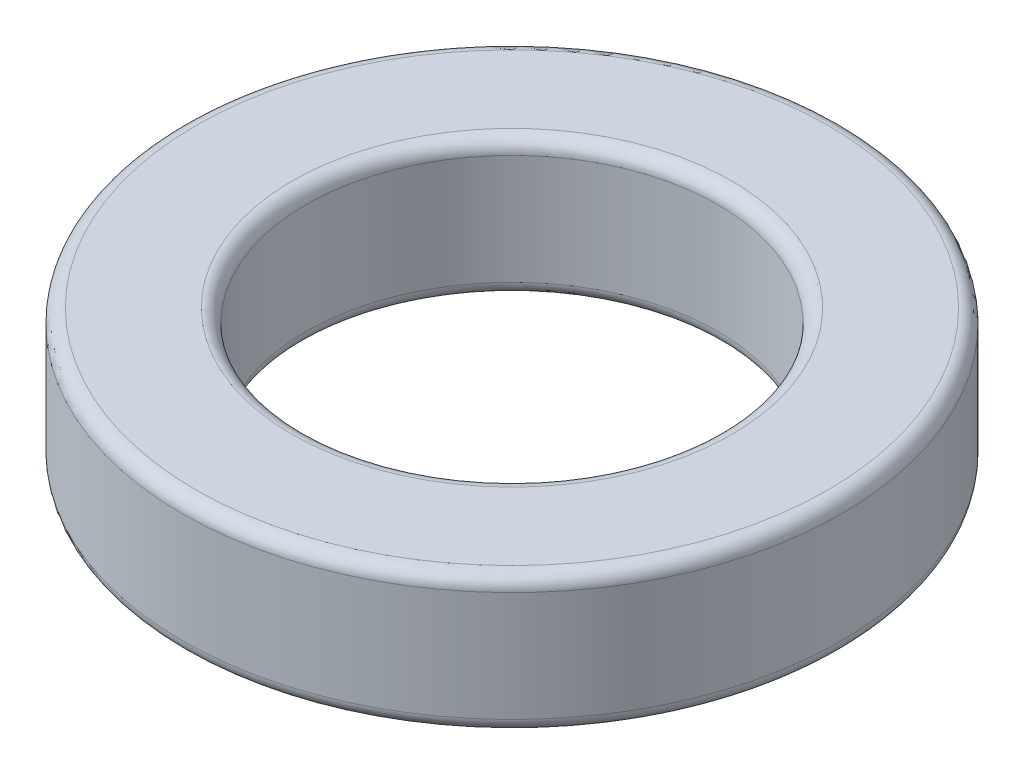
ISO-10303-21;
HEADER;
FILE_DESCRIPTION(('STEP AP214'),'2;1');
FILE_NAME('part.step','',(''),(''),'','','');
FILE_SCHEMA(('AUTOMOTIVE_DESIGN { 1 0 10303 214 1 1 1 1 }'));
ENDSEC;
DATA;
#1=APPLICATION_CONTEXT('core data for automotive mechanical design processes');
#2=APPLICATION_PROTOCOL_DEFINITION('international standard','automotive_design',2000,#1);
#3=PRODUCT_CONTEXT('',#1,'mechanical');
#4=PRODUCT('Part','Part','',(#3));
#5=PRODUCT_RELATED_PRODUCT_CATEGORY('part','',(#4));
#6=PRODUCT_DEFINITION_FORMATION('','',#4);
#7=PRODUCT_DEFINITION_CONTEXT('part definition',#1,'design');
#8=PRODUCT_DEFINITION('design','',#6,#7);
#9=PRODUCT_DEFINITION_SHAPE('','',#8);
#10=(LENGTH_UNIT() NAMED_UNIT(*) SI_UNIT(.MILLI.,.METRE.));
#11=(NAMED_UNIT(*) PLANE_ANGLE_UNIT() SI_UNIT($,.RADIAN.));
#12=(NAMED_UNIT(*) SI_UNIT($,.STERADIAN.) SOLID_ANGLE_UNIT());
#13=UNCERTAINTY_MEASURE_WITH_UNIT(LENGTH_MEASURE(1.E-05),#10,'distance_accuracy_value','');
#14=(GEOMETRIC_REPRESENTATION_CONTEXT(3) GLOBAL_UNCERTAINTY_ASSIGNED_CONTEXT((#13)) GLOBAL_UNIT_ASSIGNED_CONTEXT((#10,
#11,#12)) REPRESENTATION_CONTEXT('',''));
#15=CARTESIAN_POINT('',(0.,0.,0.));
#16=DIRECTION('',(0.,0.,1.));
#17=DIRECTION('',(1.,0.,0.));
#18=AXIS2_PLACEMENT_3D('',#15,#16,#17);
#19=CARTESIAN_POINT('',(0.,-0.5,0.));
#20=DIRECTION('',(0.,1.,0.));
#21=DIRECTION('',(0.,0.,1.));
#22=AXIS2_PLACEMENT_3D('',#19,#20,#21);
#23=TOROIDAL_SURFACE('',#22,11.5,0.5);
#24=CARTESIAN_POINT('',(0.,-0.5,0.));
#25=DIRECTION('',(0.,1.,0.));
#26=DIRECTION('',(0.,0.,1.));
#27=AXIS2_PLACEMENT_3D('',#24,#25,#26);
#28=CIRCLE('',#27,12.);
#29=CARTESIAN_POINT('',(0.,-0.5,12.));
#30=VERTEX_POINT('',#29);
#31=EDGE_CURVE('E10',#30,#30,#28,.T.);
#32=ORIENTED_EDGE('',*,*,#31,.T.);
#33=EDGE_LOOP('',(#32));
#34=FACE_BOUND('',#33,.T.);
#35=CARTESIAN_POINT('',(0.,0.,0.));
#36=DIRECTION('',(0.,1.,0.));
#37=DIRECTION('',(0.,0.,1.));
#38=AXIS2_PLACEMENT_3D('',#35,#36,#37);
#39=CIRCLE('',#38,11.5);
#40=CARTESIAN_POINT('',(0.,0.,11.5));
#41=VERTEX_POINT('',#40);
#42=EDGE_CURVE('E76',#41,#41,#39,.T.);
#43=ORIENTED_EDGE('',*,*,#42,.F.);
#44=EDGE_LOOP('',(#43));
#45=FACE_BOUND('',#44,.T.);
#46=ADVANCED_FACE('F41',(#34,#45),#23,.T.);
#47=CARTESIAN_POINT('',(0.,-5.,0.));
#48=DIRECTION('',(0.,1.,0.));
#49=DIRECTION('',(0.,0.,1.));
#50=AXIS2_PLACEMENT_3D('',#47,#48,#49);
#51=CYLINDRICAL_SURFACE('',#50,12.);
#52=CARTESIAN_POINT('',(0.,-4.5,0.));
#53=DIRECTION('',(0.,1.,0.));
#54=DIRECTION('',(0.,0.,1.));
#55=AXIS2_PLACEMENT_3D('',#52,#53,#54);
#56=CIRCLE('',#55,12.);
#57=CARTESIAN_POINT('',(0.,-4.5,12.));
#58=VERTEX_POINT('',#57);
#59=EDGE_CURVE('E48',#58,#58,#56,.T.);
#60=ORIENTED_EDGE('',*,*,#59,.T.);
#61=EDGE_LOOP('',(#60));
#62=FACE_BOUND('',#61,.T.);
#63=ORIENTED_EDGE('',*,*,#31,.F.);
#64=EDGE_LOOP('',(#63));
#65=FACE_BOUND('',#64,.T.);
#66=ADVANCED_FACE('F85',(#62,#65),#51,.T.);
#67=CARTESIAN_POINT('',(0.,-4.5,0.));
#68=DIRECTION('',(0.,1.,0.));
#69=DIRECTION('',(0.,0.,1.));
#70=AXIS2_PLACEMENT_3D('',#67,#68,#69);
#71=TOROIDAL_SURFACE('',#70,11.5,0.5);
#72=CARTESIAN_POINT('',(0.,-5.,0.));
#73=DIRECTION('',(0.,1.,0.));
#74=DIRECTION('',(0.,0.,1.));
#75=AXIS2_PLACEMENT_3D('',#72,#73,#74);
#76=CIRCLE('',#75,11.5);
#77=CARTESIAN_POINT('',(0.,-5.,11.5));
#78=VERTEX_POINT('',#77);
#79=EDGE_CURVE('E53',#78,#78,#76,.T.);
#80=ORIENTED_EDGE('',*,*,#79,.T.);
#81=EDGE_LOOP('',(#80));
#82=FACE_BOUND('',#81,.T.);
#83=ORIENTED_EDGE('',*,*,#59,.F.);
#84=EDGE_LOOP('',(#83));
#85=FACE_BOUND('',#84,.T.);
#86=ADVANCED_FACE('F89',(#82,#85),#71,.T.);
#87=CARTESIAN_POINT('',(11.5,-5.,0.));
#88=DIRECTION('',(0.,-1.,0.));
#89=DIRECTION('',(0.,0.,-1.));
#90=AXIS2_PLACEMENT_3D('',#87,#88,#89);
#91=PLANE('',#90);
#92=CARTESIAN_POINT('',(0.,-5.,0.));
#93=DIRECTION('',(0.,1.,0.));
#94=DIRECTION('',(0.,0.,1.));
#95=AXIS2_PLACEMENT_3D('',#92,#93,#94);
#96=CIRCLE('',#95,8.);
#97=CARTESIAN_POINT('',(0.,-5.,8.));
#98=VERTEX_POINT('',#97);
#99=EDGE_CURVE('E58',#98,#98,#96,.T.);
#100=ORIENTED_EDGE('',*,*,#99,.T.);
#101=EDGE_LOOP('',(#100));
#102=FACE_BOUND('',#101,.T.);
#103=ORIENTED_EDGE('',*,*,#79,.F.);
#104=EDGE_LOOP('',(#103));
#105=FACE_BOUND('',#104,.T.);
#106=ADVANCED_FACE('F93',(#102,#105),#91,.T.);
#107=CARTESIAN_POINT('',(0.,-4.5,0.));
#108=DIRECTION('',(0.,1.,0.));
#109=DIRECTION('',(0.,0.,1.));
#110=AXIS2_PLACEMENT_3D('',#107,#108,#109);
#111=TOROIDAL_SURFACE('',#110,8.,0.5);
#112=CARTESIAN_POINT('',(0.,-4.5,0.));
#113=DIRECTION('',(0.,1.,0.));
#114=DIRECTION('',(0.,0.,1.));
#115=AXIS2_PLACEMENT_3D('',#112,#113,#114);
#116=CIRCLE('',#115,7.5);
#117=CARTESIAN_POINT('',(0.,-4.5,7.5));
#118=VERTEX_POINT('',#117);
#119=EDGE_CURVE('E64',#118,#118,#116,.T.);
#120=ORIENTED_EDGE('',*,*,#119,.T.);
#121=EDGE_LOOP('',(#120));
#122=FACE_BOUND('',#121,.T.);
#123=ORIENTED_EDGE('',*,*,#99,.F.);
#124=EDGE_LOOP('',(#123));
#125=FACE_BOUND('',#124,.T.);
#126=ADVANCED_FACE('F100',(#122,#125),#111,.T.);
#127=CARTESIAN_POINT('',(0.,-5.,0.));
#128=DIRECTION('',(0.,1.,0.));
#129=DIRECTION('',(0.,0.,1.));
#130=AXIS2_PLACEMENT_3D('',#127,#128,#129);
#131=CYLINDRICAL_SURFACE('',#130,7.5);
#132=CARTESIAN_POINT('',(0.,-0.5,0.));
#133=DIRECTION('',(0.,1.,0.));
#134=DIRECTION('',(0.,0.,1.));
#135=AXIS2_PLACEMENT_3D('',#132,#133,#134);
#136=CIRCLE('',#135,7.5);
#137=CARTESIAN_POINT('',(0.,-0.5,7.5));
#138=VERTEX_POINT('',#137);
#139=EDGE_CURVE('E68',#138,#138,#136,.T.);
#140=ORIENTED_EDGE('',*,*,#139,.T.);
#141=EDGE_LOOP('',(#140));
#142=FACE_BOUND('',#141,.T.);
#143=ORIENTED_EDGE('',*,*,#119,.F.);
#144=EDGE_LOOP('',(#143));
#145=FACE_BOUND('',#144,.T.);
#146=ADVANCED_FACE('F104',(#142,#145),#131,.F.);
#147=CARTESIAN_POINT('',(0.,-0.5,0.));
#148=DIRECTION('',(0.,1.,0.));
#149=DIRECTION('',(0.,0.,1.));
#150=AXIS2_PLACEMENT_3D('',#147,#148,#149);
#151=TOROIDAL_SURFACE('',#150,8.,0.5);
#152=CARTESIAN_POINT('',(0.,0.,0.));
#153=DIRECTION('',(0.,1.,0.));
#154=DIRECTION('',(0.,0.,1.));
#155=AXIS2_PLACEMENT_3D('',#152,#153,#154);
#156=CIRCLE('',#155,8.);
#157=CARTESIAN_POINT('',(0.,0.,8.));
#158=VERTEX_POINT('',#157);
#159=EDGE_CURVE('E72',#158,#158,#156,.T.);
#160=ORIENTED_EDGE('',*,*,#159,.T.);
#161=EDGE_LOOP('',(#160));
#162=FACE_BOUND('',#161,.T.);
#163=ORIENTED_EDGE('',*,*,#139,.F.);
#164=EDGE_LOOP('',(#163));
#165=FACE_BOUND('',#164,.T.);
#166=ADVANCED_FACE('F108',(#162,#165),#151,.T.);
#167=CARTESIAN_POINT('',(8.,0.,0.));
#168=DIRECTION('',(0.,1.,0.));
#169=DIRECTION('',(0.,0.,1.));
#170=AXIS2_PLACEMENT_3D('',#167,#168,#169);
#171=PLANE('',#170);
#172=ORIENTED_EDGE('',*,*,#42,.T.);
#173=EDGE_LOOP('',(#172));
#174=FACE_BOUND('',#173,.T.);
#175=ORIENTED_EDGE('',*,*,#159,.F.);
#176=EDGE_LOOP('',(#175));
#177=FACE_BOUND('',#176,.T.);
#178=ADVANCED_FACE('F81',(#174,#177),#171,.T.);
#179=CLOSED_SHELL('',(#46,#66,#86,#106,#126,#146,#166,#178));
#180=MANIFOLD_SOLID_BREP('B2',#179);
#181=ADVANCED_BREP_SHAPE_REPRESENTATION('',(#18,#180),#14);
#182=SHAPE_DEFINITION_REPRESENTATION(#9,#181);
ENDSEC;
END-ISO-10303-21;
